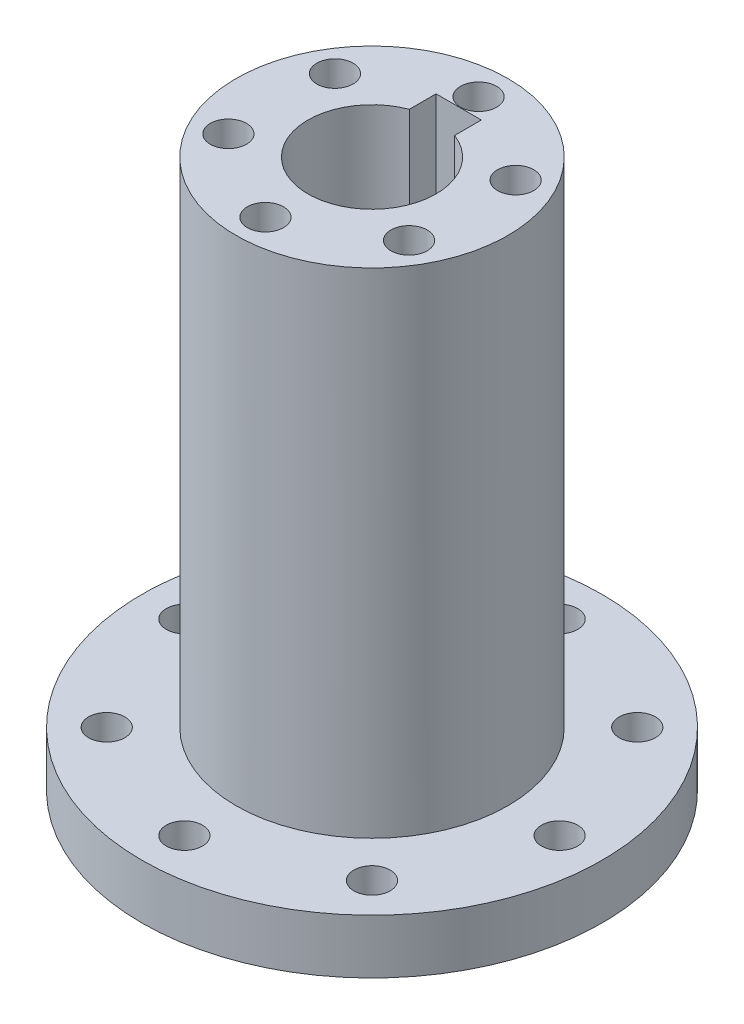
ISO-10303-21;
HEADER;
FILE_DESCRIPTION(('STEP AP214'),'2;1');
FILE_NAME('part.step','',(''),(''),'','','');
FILE_SCHEMA(('AUTOMOTIVE_DESIGN { 1 0 10303 214 1 1 1 1 }'));
ENDSEC;
DATA;
#1=APPLICATION_CONTEXT('core data for automotive mechanical design processes');
#2=APPLICATION_PROTOCOL_DEFINITION('international standard','automotive_design',2000,#1);
#3=PRODUCT_CONTEXT('',#1,'mechanical');
#4=PRODUCT('Part','Part','',(#3));
#5=PRODUCT_RELATED_PRODUCT_CATEGORY('part','',(#4));
#6=PRODUCT_DEFINITION_FORMATION('','',#4);
#7=PRODUCT_DEFINITION_CONTEXT('part definition',#1,'design');
#8=PRODUCT_DEFINITION('design','',#6,#7);
#9=PRODUCT_DEFINITION_SHAPE('','',#8);
#10=(LENGTH_UNIT() NAMED_UNIT(*) SI_UNIT(.MILLI.,.METRE.));
#11=(NAMED_UNIT(*) PLANE_ANGLE_UNIT() SI_UNIT($,.RADIAN.));
#12=(NAMED_UNIT(*) SI_UNIT($,.STERADIAN.) SOLID_ANGLE_UNIT());
#13=UNCERTAINTY_MEASURE_WITH_UNIT(LENGTH_MEASURE(1.E-05),#10,'distance_accuracy_value','');
#14=(GEOMETRIC_REPRESENTATION_CONTEXT(3) GLOBAL_UNCERTAINTY_ASSIGNED_CONTEXT((#13)) GLOBAL_UNIT_ASSIGNED_CONTEXT((#10,
#11,#12)) REPRESENTATION_CONTEXT('',''));
#15=CARTESIAN_POINT('',(0.,0.,0.));
#16=DIRECTION('',(0.,0.,1.));
#17=DIRECTION('',(1.,0.,0.));
#18=AXIS2_PLACEMENT_3D('',#15,#16,#17);
#19=CARTESIAN_POINT('',(0.,0.,0.));
#20=DIRECTION('',(0.,1.,0.));
#21=DIRECTION('',(0.,0.,1.));
#22=AXIS2_PLACEMENT_3D('',#19,#20,#21);
#23=PLANE('',#22);
#24=CARTESIAN_POINT('',(-14.6371103705617,0.,14.6371103705614));
#25=DIRECTION('',(0.,-1.,0.));
#26=DIRECTION('',(0.,0.,-1.));
#27=AXIS2_PLACEMENT_3D('',#24,#25,#26);
#28=CIRCLE('',#27,1.99999999999999);
#29=CARTESIAN_POINT('',(-14.6371103705617,0.,12.6371103705614));
#30=VERTEX_POINT('',#29);
#31=EDGE_CURVE('E174',#30,#30,#28,.T.);
#32=ORIENTED_EDGE('',*,*,#31,.F.);
#33=EDGE_LOOP('',(#32));
#34=FACE_BOUND('',#33,.T.);
#35=CARTESIAN_POINT('',(0.,0.,20.7));
#36=DIRECTION('',(0.,-1.,0.));
#37=DIRECTION('',(0.,0.,-1.));
#38=AXIS2_PLACEMENT_3D('',#35,#36,#37);
#39=CIRCLE('',#38,1.99999999999999);
#40=CARTESIAN_POINT('',(0.,0.,18.7));
#41=VERTEX_POINT('',#40);
#42=EDGE_CURVE('E180',#41,#41,#39,.T.);
#43=ORIENTED_EDGE('',*,*,#42,.F.);
#44=EDGE_LOOP('',(#43));
#45=FACE_BOUND('',#44,.T.);
#46=CARTESIAN_POINT('',(14.6371103705615,0.,14.6371103705616));
#47=DIRECTION('',(0.,-1.,0.));
#48=DIRECTION('',(0.,0.,-1.));
#49=AXIS2_PLACEMENT_3D('',#46,#47,#48);
#50=CIRCLE('',#49,1.99999999999999);
#51=CARTESIAN_POINT('',(14.6371103705615,0.,12.6371103705616));
#52=VERTEX_POINT('',#51);
#53=EDGE_CURVE('E186',#52,#52,#50,.T.);
#54=ORIENTED_EDGE('',*,*,#53,.F.);
#55=EDGE_LOOP('',(#54));
#56=FACE_BOUND('',#55,.T.);
#57=CARTESIAN_POINT('',(20.7,0.,0.));
#58=DIRECTION('',(0.,-1.,0.));
#59=DIRECTION('',(0.,0.,-1.));
#60=AXIS2_PLACEMENT_3D('',#57,#58,#59);
#61=CIRCLE('',#60,1.99999999999999);
#62=CARTESIAN_POINT('',(20.7,0.,-1.99999999999992));
#63=VERTEX_POINT('',#62);
#64=EDGE_CURVE('E192',#63,#63,#61,.T.);
#65=ORIENTED_EDGE('',*,*,#64,.F.);
#66=EDGE_LOOP('',(#65));
#67=FACE_BOUND('',#66,.T.);
#68=CARTESIAN_POINT('',(14.6371103705616,0.,-14.6371103705615));
#69=DIRECTION('',(0.,-1.,0.));
#70=DIRECTION('',(0.,0.,-1.));
#71=AXIS2_PLACEMENT_3D('',#68,#69,#70);
#72=CIRCLE('',#71,1.99999999999999);
#73=CARTESIAN_POINT('',(14.6371103705616,0.,-16.6371103705615));
#74=VERTEX_POINT('',#73);
#75=EDGE_CURVE('E198',#74,#74,#72,.T.);
#76=ORIENTED_EDGE('',*,*,#75,.F.);
#77=EDGE_LOOP('',(#76));
#78=FACE_BOUND('',#77,.T.);
#79=CARTESIAN_POINT('',(0.,0.,-20.7));
#80=DIRECTION('',(0.,-1.,0.));
#81=DIRECTION('',(0.,0.,-1.));
#82=AXIS2_PLACEMENT_3D('',#79,#80,#81);
#83=CIRCLE('',#82,1.99999999999999);
#84=CARTESIAN_POINT('',(0.,0.,-22.7));
#85=VERTEX_POINT('',#84);
#86=EDGE_CURVE('E134',#85,#85,#83,.T.);
#87=ORIENTED_EDGE('',*,*,#86,.F.);
#88=EDGE_LOOP('',(#87));
#89=FACE_BOUND('',#88,.T.);
#90=CARTESIAN_POINT('',(0.,0.,0.));
#91=DIRECTION('',(0.,-1.,0.));
#92=DIRECTION('',(0.,0.,-1.));
#93=AXIS2_PLACEMENT_3D('',#90,#91,#92);
#94=CIRCLE('',#93,10.315);
#95=CARTESIAN_POINT('',(0.,0.,-10.315));
#96=VERTEX_POINT('',#95);
#97=EDGE_CURVE('E131',#96,#96,#94,.T.);
#98=ORIENTED_EDGE('',*,*,#97,.F.);
#99=EDGE_LOOP('',(#98));
#100=FACE_BOUND('',#99,.T.);
#101=CARTESIAN_POINT('',(0.,0.,0.));
#102=DIRECTION('',(0.,1.,0.));
#103=DIRECTION('',(0.,0.,1.));
#104=AXIS2_PLACEMENT_3D('',#101,#102,#103);
#105=CIRCLE('',#104,25.4);
#106=CARTESIAN_POINT('',(0.,0.,25.4));
#107=VERTEX_POINT('',#106);
#108=EDGE_CURVE('E144',#107,#107,#105,.T.);
#109=ORIENTED_EDGE('',*,*,#108,.F.);
#110=EDGE_LOOP('',(#109));
#111=FACE_BOUND('',#110,.T.);
#112=CARTESIAN_POINT('',(-20.7,0.,-2.16820991142159E-13));
#113=DIRECTION('',(0.,-1.,0.));
#114=DIRECTION('',(0.,0.,-1.));
#115=AXIS2_PLACEMENT_3D('',#112,#113,#114);
#116=CIRCLE('',#115,1.99999999999999);
#117=CARTESIAN_POINT('',(-20.7,0.,-2.00000000000021));
#118=VERTEX_POINT('',#117);
#119=EDGE_CURVE('E157',#118,#118,#116,.T.);
#120=ORIENTED_EDGE('',*,*,#119,.F.);
#121=EDGE_LOOP('',(#120));
#122=FACE_BOUND('',#121,.T.);
#123=CARTESIAN_POINT('',(-14.6371103705614,0.,-14.6371103705617));
#124=DIRECTION('',(0.,-1.,0.));
#125=DIRECTION('',(0.,0.,-1.));
#126=AXIS2_PLACEMENT_3D('',#123,#124,#125);
#127=CIRCLE('',#126,1.99999999999999);
#128=CARTESIAN_POINT('',(-14.6371103705614,0.,-16.6371103705617));
#129=VERTEX_POINT('',#128);
#130=EDGE_CURVE('E160',#129,#129,#127,.T.);
#131=ORIENTED_EDGE('',*,*,#130,.F.);
#132=EDGE_LOOP('',(#131));
#133=FACE_BOUND('',#132,.T.);
#134=ADVANCED_FACE('F47',(#34,#45,#56,#67,#78,#89,#100,#111,#122,#133),#23,.F.);
#135=CARTESIAN_POINT('',(0.,6.,0.));
#136=DIRECTION('',(0.,-1.,0.));
#137=DIRECTION('',(0.,0.,-1.));
#138=AXIS2_PLACEMENT_3D('',#135,#136,#137);
#139=CYLINDRICAL_SURFACE('',#138,25.4);
#140=CARTESIAN_POINT('',(0.,6.,0.));
#141=DIRECTION('',(0.,1.,0.));
#142=DIRECTION('',(0.,0.,1.));
#143=AXIS2_PLACEMENT_3D('',#140,#141,#142);
#144=CIRCLE('',#143,25.4);
#145=CARTESIAN_POINT('',(0.,6.,25.4));
#146=VERTEX_POINT('',#145);
#147=EDGE_CURVE('E56',#146,#146,#144,.T.);
#148=ORIENTED_EDGE('',*,*,#147,.F.);
#149=EDGE_LOOP('',(#148));
#150=FACE_BOUND('',#149,.T.);
#151=ORIENTED_EDGE('',*,*,#108,.T.);
#152=EDGE_LOOP('',(#151));
#153=FACE_BOUND('',#152,.T.);
#154=ADVANCED_FACE('F49',(#150,#153),#139,.T.);
#155=CARTESIAN_POINT('',(0.,6.,0.));
#156=DIRECTION('',(0.,1.,0.));
#157=DIRECTION('',(0.,0.,1.));
#158=AXIS2_PLACEMENT_3D('',#155,#156,#157);
#159=PLANE('',#158);
#160=CARTESIAN_POINT('',(-14.6371103705614,6.,-14.6371103705617));
#161=DIRECTION('',(0.,1.,0.));
#162=DIRECTION('',(0.,0.,1.));
#163=AXIS2_PLACEMENT_3D('',#160,#161,#162);
#164=CIRCLE('',#163,1.99999999999999);
#165=CARTESIAN_POINT('',(-14.6371103705614,6.,-12.6371103705617));
#166=VERTEX_POINT('',#165);
#167=EDGE_CURVE('E51',#166,#166,#164,.T.);
#168=ORIENTED_EDGE('',*,*,#167,.F.);
#169=EDGE_LOOP('',(#168));
#170=FACE_BOUND('',#169,.T.);
#171=CARTESIAN_POINT('',(-20.7,6.,-2.16820991142159E-13));
#172=DIRECTION('',(0.,1.,0.));
#173=DIRECTION('',(0.,0.,1.));
#174=AXIS2_PLACEMENT_3D('',#171,#172,#173);
#175=CIRCLE('',#174,1.99999999999999);
#176=CARTESIAN_POINT('',(-20.7,6.,1.99999999999977));
#177=VERTEX_POINT('',#176);
#178=EDGE_CURVE('E171',#177,#177,#175,.T.);
#179=ORIENTED_EDGE('',*,*,#178,.F.);
#180=EDGE_LOOP('',(#179));
#181=FACE_BOUND('',#180,.T.);
#182=CARTESIAN_POINT('',(-14.6371103705617,6.,14.6371103705614));
#183=DIRECTION('',(0.,1.,0.));
#184=DIRECTION('',(0.,0.,1.));
#185=AXIS2_PLACEMENT_3D('',#182,#183,#184);
#186=CIRCLE('',#185,1.99999999999999);
#187=CARTESIAN_POINT('',(-14.6371103705617,6.,16.6371103705614));
#188=VERTEX_POINT('',#187);
#189=EDGE_CURVE('E177',#188,#188,#186,.T.);
#190=ORIENTED_EDGE('',*,*,#189,.F.);
#191=EDGE_LOOP('',(#190));
#192=FACE_BOUND('',#191,.T.);
#193=CARTESIAN_POINT('',(0.,6.,20.7));
#194=DIRECTION('',(0.,1.,0.));
#195=DIRECTION('',(0.,0.,1.));
#196=AXIS2_PLACEMENT_3D('',#193,#194,#195);
#197=CIRCLE('',#196,1.99999999999999);
#198=CARTESIAN_POINT('',(0.,6.,22.7));
#199=VERTEX_POINT('',#198);
#200=EDGE_CURVE('E183',#199,#199,#197,.T.);
#201=ORIENTED_EDGE('',*,*,#200,.F.);
#202=EDGE_LOOP('',(#201));
#203=FACE_BOUND('',#202,.T.);
#204=CARTESIAN_POINT('',(14.6371103705615,6.,14.6371103705616));
#205=DIRECTION('',(0.,1.,0.));
#206=DIRECTION('',(0.,0.,1.));
#207=AXIS2_PLACEMENT_3D('',#204,#205,#206);
#208=CIRCLE('',#207,1.99999999999999);
#209=CARTESIAN_POINT('',(14.6371103705615,6.,16.6371103705616));
#210=VERTEX_POINT('',#209);
#211=EDGE_CURVE('E189',#210,#210,#208,.T.);
#212=ORIENTED_EDGE('',*,*,#211,.F.);
#213=EDGE_LOOP('',(#212));
#214=FACE_BOUND('',#213,.T.);
#215=CARTESIAN_POINT('',(20.7,6.,0.));
#216=DIRECTION('',(0.,1.,0.));
#217=DIRECTION('',(0.,0.,1.));
#218=AXIS2_PLACEMENT_3D('',#215,#216,#217);
#219=CIRCLE('',#218,1.99999999999999);
#220=CARTESIAN_POINT('',(20.7,6.,2.00000000000006));
#221=VERTEX_POINT('',#220);
#222=EDGE_CURVE('E195',#221,#221,#219,.T.);
#223=ORIENTED_EDGE('',*,*,#222,.F.);
#224=EDGE_LOOP('',(#223));
#225=FACE_BOUND('',#224,.T.);
#226=CARTESIAN_POINT('',(14.6371103705616,6.,-14.6371103705615));
#227=DIRECTION('',(0.,1.,0.));
#228=DIRECTION('',(0.,0.,1.));
#229=AXIS2_PLACEMENT_3D('',#226,#227,#228);
#230=CIRCLE('',#229,1.99999999999999);
#231=CARTESIAN_POINT('',(14.6371103705616,6.,-12.6371103705615));
#232=VERTEX_POINT('',#231);
#233=EDGE_CURVE('E201',#232,#232,#230,.T.);
#234=ORIENTED_EDGE('',*,*,#233,.F.);
#235=EDGE_LOOP('',(#234));
#236=FACE_BOUND('',#235,.T.);
#237=CARTESIAN_POINT('',(0.,6.,-20.7));
#238=DIRECTION('',(0.,1.,0.));
#239=DIRECTION('',(0.,0.,1.));
#240=AXIS2_PLACEMENT_3D('',#237,#238,#239);
#241=CIRCLE('',#240,1.99999999999999);
#242=CARTESIAN_POINT('',(0.,6.,-18.7));
#243=VERTEX_POINT('',#242);
#244=EDGE_CURVE('E129',#243,#243,#241,.T.);
#245=ORIENTED_EDGE('',*,*,#244,.F.);
#246=EDGE_LOOP('',(#245));
#247=FACE_BOUND('',#246,.T.);
#248=CARTESIAN_POINT('',(0.,6.,0.));
#249=DIRECTION('',(0.,1.,0.));
#250=DIRECTION('',(0.,0.,1.));
#251=AXIS2_PLACEMENT_3D('',#248,#249,#250);
#252=CIRCLE('',#251,15.);
#253=CARTESIAN_POINT('',(0.,6.,15.));
#254=VERTEX_POINT('',#253);
#255=EDGE_CURVE('E11',#254,#254,#252,.T.);
#256=ORIENTED_EDGE('',*,*,#255,.F.);
#257=EDGE_LOOP('',(#256));
#258=FACE_BOUND('',#257,.T.);
#259=ORIENTED_EDGE('',*,*,#147,.T.);
#260=EDGE_LOOP('',(#259));
#261=FACE_BOUND('',#260,.T.);
#262=ADVANCED_FACE('F231',(#170,#181,#192,#203,#214,#225,#236,#247,#258,#261),#159,.T.);
#263=CARTESIAN_POINT('',(0.,60.5,0.));
#264=DIRECTION('',(0.,-1.,0.));
#265=DIRECTION('',(0.,0.,-1.));
#266=AXIS2_PLACEMENT_3D('',#263,#264,#265);
#267=CYLINDRICAL_SURFACE('',#266,15.);
#268=ORIENTED_EDGE('',*,*,#255,.T.);
#269=EDGE_LOOP('',(#268));
#270=FACE_BOUND('',#269,.T.);
#271=CARTESIAN_POINT('',(0.,60.5,0.));
#272=DIRECTION('',(0.,-1.,0.));
#273=DIRECTION('',(0.,0.,-1.));
#274=AXIS2_PLACEMENT_3D('',#271,#272,#273);
#275=CIRCLE('',#274,15.);
#276=CARTESIAN_POINT('',(0.,60.5,-15.));
#277=VERTEX_POINT('',#276);
#278=EDGE_CURVE('E140',#277,#277,#275,.T.);
#279=ORIENTED_EDGE('',*,*,#278,.T.);
#280=EDGE_LOOP('',(#279));
#281=FACE_BOUND('',#280,.T.);
#282=ADVANCED_FACE('F224',(#270,#281),#267,.T.);
#283=CARTESIAN_POINT('',(0.,60.5,0.));
#284=DIRECTION('',(0.,-1.,0.));
#285=DIRECTION('',(0.,0.,-1.));
#286=AXIS2_PLACEMENT_3D('',#283,#284,#285);
#287=PLANE('',#286);
#288=CARTESIAN_POINT('',(-0.124994944390991,60.5,11.6364975943742));
#289=DIRECTION('',(0.,1.,0.));
#290=DIRECTION('',(0.,0.,1.));
#291=AXIS2_PLACEMENT_3D('',#288,#289,#290);
#292=CIRCLE('',#291,2.);
#293=CARTESIAN_POINT('',(-0.124994944390991,60.5,13.6364975943742));
#294=VERTEX_POINT('',#293);
#295=EDGE_CURVE('E366',#294,#294,#292,.T.);
#296=ORIENTED_EDGE('',*,*,#295,.F.);
#297=EDGE_LOOP('',(#296));
#298=FACE_BOUND('',#297,.T.);
#299=CARTESIAN_POINT('',(10.0150050556091,60.5,5.9264975943743));
#300=DIRECTION('',(0.,1.,0.));
#301=DIRECTION('',(0.,0.,1.));
#302=AXIS2_PLACEMENT_3D('',#299,#300,#301);
#303=CIRCLE('',#302,2.);
#304=CARTESIAN_POINT('',(10.0150050556091,60.5,7.9264975943743));
#305=VERTEX_POINT('',#304);
#306=EDGE_CURVE('E374',#305,#305,#303,.T.);
#307=ORIENTED_EDGE('',*,*,#306,.F.);
#308=EDGE_LOOP('',(#307));
#309=FACE_BOUND('',#308,.T.);
#310=CARTESIAN_POINT('',(10.14,60.5,-5.71));
#311=DIRECTION('',(0.,1.,0.));
#312=DIRECTION('',(0.,0.,1.));
#313=AXIS2_PLACEMENT_3D('',#310,#311,#312);
#314=CIRCLE('',#313,2.);
#315=CARTESIAN_POINT('',(10.14,60.5,-3.71));
#316=VERTEX_POINT('',#315);
#317=EDGE_CURVE('E380',#316,#316,#314,.T.);
#318=ORIENTED_EDGE('',*,*,#317,.F.);
#319=EDGE_LOOP('',(#318));
#320=FACE_BOUND('',#319,.T.);
#321=CARTESIAN_POINT('',(0.124994944390909,60.5,-11.6364975943742));
#322=DIRECTION('',(0.,1.,0.));
#323=DIRECTION('',(0.,0.,1.));
#324=AXIS2_PLACEMENT_3D('',#321,#322,#323);
#325=CIRCLE('',#324,2.);
#326=CARTESIAN_POINT('',(0.124994944390909,60.5,-9.63649759437421));
#327=VERTEX_POINT('',#326);
#328=EDGE_CURVE('E386',#327,#327,#325,.T.);
#329=ORIENTED_EDGE('',*,*,#328,.F.);
#330=EDGE_LOOP('',(#329));
#331=FACE_BOUND('',#330,.T.);
#332=CARTESIAN_POINT('',(-10.0150050556091,60.5,-5.92649759437423));
#333=DIRECTION('',(0.,1.,0.));
#334=DIRECTION('',(0.,0.,1.));
#335=AXIS2_PLACEMENT_3D('',#332,#333,#334);
#336=CIRCLE('',#335,2.);
#337=CARTESIAN_POINT('',(-10.0150050556091,60.5,-3.92649759437423));
#338=VERTEX_POINT('',#337);
#339=EDGE_CURVE('E392',#338,#338,#336,.T.);
#340=ORIENTED_EDGE('',*,*,#339,.F.);
#341=EDGE_LOOP('',(#340));
#342=FACE_BOUND('',#341,.T.);
#343=CARTESIAN_POINT('',(-10.14,60.5,5.71));
#344=DIRECTION('',(0.,1.,0.));
#345=DIRECTION('',(0.,0.,1.));
#346=AXIS2_PLACEMENT_3D('',#343,#344,#345);
#347=CIRCLE('',#346,2.);
#348=CARTESIAN_POINT('',(-10.14,60.5,7.71));
#349=VERTEX_POINT('',#348);
#350=EDGE_CURVE('E166',#349,#349,#347,.T.);
#351=ORIENTED_EDGE('',*,*,#350,.F.);
#352=EDGE_LOOP('',(#351));
#353=FACE_BOUND('',#352,.T.);
#354=CARTESIAN_POINT('',(0.,60.5,0.));
#355=DIRECTION('',(0.,-1.,0.));
#356=DIRECTION('',(0.,0.,-1.));
#357=AXIS2_PLACEMENT_3D('',#354,#355,#356);
#358=CIRCLE('',#357,7.07);
#359=CARTESIAN_POINT('',(2.5,60.5,-6.61323672644493));
#360=VERTEX_POINT('',#359);
#361=CARTESIAN_POINT('',(-2.5,60.5,-6.61323672644493));
#362=VERTEX_POINT('',#361);
#363=EDGE_CURVE('E128',#360,#362,#358,.T.);
#364=ORIENTED_EDGE('',*,*,#363,.T.);
#365=DIRECTION('',(0.,0.,1.));
#366=VECTOR('',#365,1.);
#367=CARTESIAN_POINT('',(-2.5,60.5,-9.57));
#368=LINE('',#367,#366);
#369=CARTESIAN_POINT('',(-2.5,60.5,-9.57));
#370=VERTEX_POINT('',#369);
#371=EDGE_CURVE('E111',#370,#362,#368,.T.);
#372=ORIENTED_EDGE('',*,*,#371,.F.);
#373=DIRECTION('',(-1.,0.,0.));
#374=VECTOR('',#373,1.);
#375=CARTESIAN_POINT('',(-2.5,60.5,-9.57));
#376=LINE('',#375,#374);
#377=CARTESIAN_POINT('',(2.5,60.5,-9.57));
#378=VERTEX_POINT('',#377);
#379=EDGE_CURVE('E117',#378,#370,#376,.T.);
#380=ORIENTED_EDGE('',*,*,#379,.F.);
#381=DIRECTION('',(0.,0.,-1.));
#382=VECTOR('',#381,1.);
#383=CARTESIAN_POINT('',(2.5,60.5,-9.57));
#384=LINE('',#383,#382);
#385=EDGE_CURVE('E360',#360,#378,#384,.T.);
#386=ORIENTED_EDGE('',*,*,#385,.F.);
#387=EDGE_LOOP('',(#364,#372,#380,#386));
#388=FACE_BOUND('',#387,.T.);
#389=ORIENTED_EDGE('',*,*,#278,.F.);
#390=EDGE_LOOP('',(#389));
#391=FACE_BOUND('',#390,.T.);
#392=ADVANCED_FACE('F214',(#298,#309,#320,#331,#342,#353,#388,#391),#287,.F.);
#393=CARTESIAN_POINT('',(0.,38.1,0.));
#394=DIRECTION('',(0.,-1.,0.));
#395=DIRECTION('',(0.,0.,-1.));
#396=AXIS2_PLACEMENT_3D('',#393,#394,#395);
#397=CYLINDRICAL_SURFACE('',#396,10.315);
#398=CARTESIAN_POINT('',(0.,38.1,0.));
#399=DIRECTION('',(0.,-1.,0.));
#400=DIRECTION('',(0.,0.,-1.));
#401=AXIS2_PLACEMENT_3D('',#398,#399,#400);
#402=CIRCLE('',#401,10.315);
#403=CARTESIAN_POINT('',(0.,38.1,-10.315));
#404=VERTEX_POINT('',#403);
#405=EDGE_CURVE('E137',#404,#404,#402,.T.);
#406=CARTESIAN_POINT('',(0.,38.1,-10.315));
#407=CARTESIAN_POINT('',(0.,37.703125,-10.315));
#408=CARTESIAN_POINT('',(0.,37.30625,-10.315));
#409=CARTESIAN_POINT('',(0.,36.5125,-10.315));
#410=CARTESIAN_POINT('',(0.,36.115625,-10.315));
#411=CARTESIAN_POINT('',(0.,35.321875,-10.315));
#412=CARTESIAN_POINT('',(0.,34.925,-10.315));
#413=CARTESIAN_POINT('',(0.,34.13125,-10.315));
#414=CARTESIAN_POINT('',(0.,33.734375,-10.315));
#415=CARTESIAN_POINT('',(0.,32.940625,-10.315));
#416=CARTESIAN_POINT('',(0.,32.54375,-10.315));
#417=CARTESIAN_POINT('',(0.,31.75,-10.315));
#418=CARTESIAN_POINT('',(0.,31.353125,-10.315));
#419=CARTESIAN_POINT('',(0.,30.559375,-10.315));
#420=CARTESIAN_POINT('',(0.,30.1625,-10.315));
#421=CARTESIAN_POINT('',(0.,29.36875,-10.315));
#422=CARTESIAN_POINT('',(0.,28.971875,-10.315));
#423=CARTESIAN_POINT('',(0.,28.178125,-10.315));
#424=CARTESIAN_POINT('',(0.,27.78125,-10.315));
#425=CARTESIAN_POINT('',(0.,26.9875,-10.315));
#426=CARTESIAN_POINT('',(0.,26.590625,-10.315));
#427=CARTESIAN_POINT('',(0.,25.796875,-10.315));
#428=CARTESIAN_POINT('',(0.,25.4,-10.315));
#429=CARTESIAN_POINT('',(0.,24.60625,-10.315));
#430=CARTESIAN_POINT('',(0.,24.209375,-10.315));
#431=CARTESIAN_POINT('',(0.,23.415625,-10.315));
#432=CARTESIAN_POINT('',(0.,23.01875,-10.315));
#433=CARTESIAN_POINT('',(0.,22.225,-10.315));
#434=CARTESIAN_POINT('',(0.,21.828125,-10.315));
#435=CARTESIAN_POINT('',(0.,21.034375,-10.315));
#436=CARTESIAN_POINT('',(0.,20.6375,-10.315));
#437=CARTESIAN_POINT('',(0.,19.84375,-10.315));
#438=CARTESIAN_POINT('',(0.,19.446875,-10.315));
#439=CARTESIAN_POINT('',(0.,18.653125,-10.315));
#440=CARTESIAN_POINT('',(0.,18.25625,-10.315));
#441=CARTESIAN_POINT('',(0.,17.4625,-10.315));
#442=CARTESIAN_POINT('',(0.,17.065625,-10.315));
#443=CARTESIAN_POINT('',(0.,16.271875,-10.315));
#444=CARTESIAN_POINT('',(0.,15.875,-10.315));
#445=CARTESIAN_POINT('',(0.,15.08125,-10.315));
#446=CARTESIAN_POINT('',(0.,14.684375,-10.315));
#447=CARTESIAN_POINT('',(0.,13.890625,-10.315));
#448=CARTESIAN_POINT('',(0.,13.49375,-10.315));
#449=CARTESIAN_POINT('',(0.,12.7,-10.315));
#450=CARTESIAN_POINT('',(0.,12.303125,-10.315));
#451=CARTESIAN_POINT('',(0.,11.509375,-10.315));
#452=CARTESIAN_POINT('',(0.,11.1125,-10.315));
#453=CARTESIAN_POINT('',(0.,10.31875,-10.315));
#454=CARTESIAN_POINT('',(0.,9.921875,-10.315));
#455=CARTESIAN_POINT('',(0.,9.128125,-10.315));
#456=CARTESIAN_POINT('',(0.,8.73125,-10.315));
#457=CARTESIAN_POINT('',(0.,7.9375,-10.315));
#458=CARTESIAN_POINT('',(0.,7.540625,-10.315));
#459=CARTESIAN_POINT('',(0.,6.746875,-10.315));
#460=CARTESIAN_POINT('',(0.,6.35,-10.315));
#461=CARTESIAN_POINT('',(0.,5.55625,-10.315));
#462=CARTESIAN_POINT('',(0.,5.159375,-10.315));
#463=CARTESIAN_POINT('',(0.,4.365625,-10.315));
#464=CARTESIAN_POINT('',(0.,3.96875,-10.315));
#465=CARTESIAN_POINT('',(0.,3.175,-10.315));
#466=CARTESIAN_POINT('',(0.,2.778125,-10.315));
#467=CARTESIAN_POINT('',(0.,1.984375,-10.315));
#468=CARTESIAN_POINT('',(0.,1.5875,-10.315));
#469=CARTESIAN_POINT('',(0.,0.79375,-10.315));
#470=CARTESIAN_POINT('',(0.,0.396875,-10.315));
#471=CARTESIAN_POINT('',(0.,0.,-10.315));
#472=B_SPLINE_CURVE_WITH_KNOTS('',3,(#406,#407,#408,#409,#410,#411,#412,#413,#414,#415,#416,
#417,#418,#419,#420,#421,#422,#423,#424,#425,#426,#427,#428,#429,#430,#431,#432,#433,#434,#435,
#436,#437,#438,#439,#440,#441,#442,#443,#444,#445,#446,#447,#448,#449,#450,#451,#452,#453,#454,
#455,#456,#457,#458,#459,#460,#461,#462,#463,#464,#465,#466,#467,#468,#469,#470,#471),
.UNSPECIFIED.,.F.,.F.,(4,2,2,2,2,2,2,2,2,2,2,2,2,2,2,2,2,2,2,2,2,2,2,2,2,2,2,2,2,2,2,2,4),(0.,
1.19062499999999,2.38124999999999,3.571875,4.7625,5.953125,7.14375,8.334375,9.525,10.715625,
11.90625,13.096875,14.2875,15.478125,16.66875,17.859375,19.05,20.240625,21.43125,22.621875,
23.8125,25.003125,26.19375,27.384375,28.575,29.765625,30.95625,32.146875,33.3375,34.528125,
35.71875,36.909375,38.1),.UNSPECIFIED.);
#473=EDGE_CURVE('BSEAM212',#404,#96,#472,.T.);
#474=ORIENTED_EDGE('',*,*,#405,.F.);
#475=ORIENTED_EDGE('',*,*,#97,.T.);
#476=ORIENTED_EDGE('',*,*,#473,.T.);
#477=ORIENTED_EDGE('',*,*,#473,.F.);
#478=EDGE_LOOP('',(#474,#476,#475,#477));
#479=FACE_BOUND('',#478,.T.);
#480=ADVANCED_FACE('F212',(#479),#397,.F.);
#481=CARTESIAN_POINT('',(0.,38.1,0.));
#482=DIRECTION('',(0.,-1.,0.));
#483=DIRECTION('',(0.,0.,-1.));
#484=AXIS2_PLACEMENT_3D('',#481,#482,#483);
#485=PLANE('',#484);
#486=DIRECTION('',(0.,0.,1.));
#487=VECTOR('',#486,1.);
#488=CARTESIAN_POINT('',(-2.5,38.1,-9.57));
#489=LINE('',#488,#487);
#490=CARTESIAN_POINT('',(-2.5,38.1,-9.57));
#491=VERTEX_POINT('',#490);
#492=CARTESIAN_POINT('',(-2.5,38.1,-6.61323672644493));
#493=VERTEX_POINT('',#492);
#494=EDGE_CURVE('E108',#491,#493,#489,.T.);
#495=ORIENTED_EDGE('',*,*,#494,.T.);
#496=CARTESIAN_POINT('',(0.,38.1,0.));
#497=DIRECTION('',(0.,-1.,0.));
#498=DIRECTION('',(0.,0.,-1.));
#499=AXIS2_PLACEMENT_3D('',#496,#497,#498);
#500=CIRCLE('',#499,7.07);
#501=CARTESIAN_POINT('',(2.5,38.1,-6.61323672644493));
#502=VERTEX_POINT('',#501);
#503=EDGE_CURVE('E124',#502,#493,#500,.T.);
#504=ORIENTED_EDGE('',*,*,#503,.F.);
#505=DIRECTION('',(0.,0.,-1.));
#506=VECTOR('',#505,1.);
#507=CARTESIAN_POINT('',(2.5,38.1,-9.57));
#508=LINE('',#507,#506);
#509=CARTESIAN_POINT('',(2.5,38.1,-9.57));
#510=VERTEX_POINT('',#509);
#511=EDGE_CURVE('E64',#502,#510,#508,.T.);
#512=ORIENTED_EDGE('',*,*,#511,.T.);
#513=DIRECTION('',(-1.,0.,0.));
#514=VECTOR('',#513,1.);
#515=CARTESIAN_POINT('',(-2.5,38.1,-9.57));
#516=LINE('',#515,#514);
#517=EDGE_CURVE('E125',#510,#491,#516,.T.);
#518=ORIENTED_EDGE('',*,*,#517,.T.);
#519=EDGE_LOOP('',(#495,#504,#512,#518));
#520=FACE_BOUND('',#519,.T.);
#521=ORIENTED_EDGE('',*,*,#405,.T.);
#522=EDGE_LOOP('',(#521));
#523=FACE_BOUND('',#522,.T.);
#524=ADVANCED_FACE('F122',(#520,#523),#485,.T.);
#525=CARTESIAN_POINT('',(0.,60.5,0.));
#526=DIRECTION('',(0.,-1.,0.));
#527=DIRECTION('',(0.,0.,-1.));
#528=AXIS2_PLACEMENT_3D('',#525,#526,#527);
#529=CYLINDRICAL_SURFACE('',#528,7.07);
#530=ORIENTED_EDGE('',*,*,#503,.T.);
#531=DIRECTION('',(0.,1.,0.));
#532=VECTOR('',#531,1.);
#533=CARTESIAN_POINT('',(-2.5,-0.001000000000001,-6.61323672644493));
#534=LINE('',#533,#532);
#535=EDGE_CURVE('E105',#493,#362,#534,.T.);
#536=ORIENTED_EDGE('',*,*,#535,.T.);
#537=ORIENTED_EDGE('',*,*,#363,.F.);
#538=DIRECTION('',(0.,1.,0.));
#539=VECTOR('',#538,1.);
#540=CARTESIAN_POINT('',(2.5,-0.001000000000001,-6.61323672644493));
#541=LINE('',#540,#539);
#542=EDGE_CURVE('E116',#502,#360,#541,.T.);
#543=ORIENTED_EDGE('',*,*,#542,.F.);
#544=EDGE_LOOP('',(#530,#536,#537,#543));
#545=FACE_BOUND('',#544,.T.);
#546=ADVANCED_FACE('F127',(#545),#529,.F.);
#547=CARTESIAN_POINT('',(0.,0.,-20.7));
#548=DIRECTION('',(0.,-1.,0.));
#549=DIRECTION('',(0.,0.,-1.));
#550=AXIS2_PLACEMENT_3D('',#547,#548,#549);
#551=CYLINDRICAL_SURFACE('',#550,1.99999999999999);
#552=ORIENTED_EDGE('',*,*,#244,.T.);
#553=EDGE_LOOP('',(#552));
#554=FACE_BOUND('',#553,.T.);
#555=ORIENTED_EDGE('',*,*,#86,.T.);
#556=EDGE_LOOP('',(#555));
#557=FACE_BOUND('',#556,.T.);
#558=ADVANCED_FACE('F207',(#554,#557),#551,.F.);
#559=CARTESIAN_POINT('',(14.6371103705616,0.,-14.6371103705615));
#560=DIRECTION('',(0.,-1.,0.));
#561=DIRECTION('',(0.,0.,-1.));
#562=AXIS2_PLACEMENT_3D('',#559,#560,#561);
#563=CYLINDRICAL_SURFACE('',#562,1.99999999999999);
#564=ORIENTED_EDGE('',*,*,#233,.T.);
#565=EDGE_LOOP('',(#564));
#566=FACE_BOUND('',#565,.T.);
#567=ORIENTED_EDGE('',*,*,#75,.T.);
#568=EDGE_LOOP('',(#567));
#569=FACE_BOUND('',#568,.T.);
#570=ADVANCED_FACE('F264',(#566,#569),#563,.F.);
#571=CARTESIAN_POINT('',(20.7,0.,0.));
#572=DIRECTION('',(0.,-1.,0.));
#573=DIRECTION('',(0.,0.,-1.));
#574=AXIS2_PLACEMENT_3D('',#571,#572,#573);
#575=CYLINDRICAL_SURFACE('',#574,1.99999999999999);
#576=ORIENTED_EDGE('',*,*,#222,.T.);
#577=EDGE_LOOP('',(#576));
#578=FACE_BOUND('',#577,.T.);
#579=ORIENTED_EDGE('',*,*,#64,.T.);
#580=EDGE_LOOP('',(#579));
#581=FACE_BOUND('',#580,.T.);
#582=ADVANCED_FACE('F268',(#578,#581),#575,.F.);
#583=CARTESIAN_POINT('',(14.6371103705615,0.,14.6371103705616));
#584=DIRECTION('',(0.,-1.,0.));
#585=DIRECTION('',(0.,0.,-1.));
#586=AXIS2_PLACEMENT_3D('',#583,#584,#585);
#587=CYLINDRICAL_SURFACE('',#586,1.99999999999999);
#588=ORIENTED_EDGE('',*,*,#211,.T.);
#589=EDGE_LOOP('',(#588));
#590=FACE_BOUND('',#589,.T.);
#591=ORIENTED_EDGE('',*,*,#53,.T.);
#592=EDGE_LOOP('',(#591));
#593=FACE_BOUND('',#592,.T.);
#594=ADVANCED_FACE('F275',(#590,#593),#587,.F.);
#595=CARTESIAN_POINT('',(0.,0.,20.7));
#596=DIRECTION('',(0.,-1.,0.));
#597=DIRECTION('',(0.,0.,-1.));
#598=AXIS2_PLACEMENT_3D('',#595,#596,#597);
#599=CYLINDRICAL_SURFACE('',#598,1.99999999999999);
#600=ORIENTED_EDGE('',*,*,#200,.T.);
#601=EDGE_LOOP('',(#600));
#602=FACE_BOUND('',#601,.T.);
#603=ORIENTED_EDGE('',*,*,#42,.T.);
#604=EDGE_LOOP('',(#603));
#605=FACE_BOUND('',#604,.T.);
#606=ADVANCED_FACE('F279',(#602,#605),#599,.F.);
#607=CARTESIAN_POINT('',(-14.6371103705617,0.,14.6371103705614));
#608=DIRECTION('',(0.,-1.,0.));
#609=DIRECTION('',(0.,0.,-1.));
#610=AXIS2_PLACEMENT_3D('',#607,#608,#609);
#611=CYLINDRICAL_SURFACE('',#610,1.99999999999999);
#612=ORIENTED_EDGE('',*,*,#189,.T.);
#613=EDGE_LOOP('',(#612));
#614=FACE_BOUND('',#613,.T.);
#615=ORIENTED_EDGE('',*,*,#31,.T.);
#616=EDGE_LOOP('',(#615));
#617=FACE_BOUND('',#616,.T.);
#618=ADVANCED_FACE('F283',(#614,#617),#611,.F.);
#619=CARTESIAN_POINT('',(-20.7,0.,-2.16820991142159E-13));
#620=DIRECTION('',(0.,-1.,0.));
#621=DIRECTION('',(0.,0.,-1.));
#622=AXIS2_PLACEMENT_3D('',#619,#620,#621);
#623=CYLINDRICAL_SURFACE('',#622,1.99999999999999);
#624=ORIENTED_EDGE('',*,*,#178,.T.);
#625=EDGE_LOOP('',(#624));
#626=FACE_BOUND('',#625,.T.);
#627=ORIENTED_EDGE('',*,*,#119,.T.);
#628=EDGE_LOOP('',(#627));
#629=FACE_BOUND('',#628,.T.);
#630=ADVANCED_FACE('F287',(#626,#629),#623,.F.);
#631=CARTESIAN_POINT('',(-14.6371103705614,0.,-14.6371103705617));
#632=DIRECTION('',(0.,-1.,0.));
#633=DIRECTION('',(0.,0.,-1.));
#634=AXIS2_PLACEMENT_3D('',#631,#632,#633);
#635=CYLINDRICAL_SURFACE('',#634,1.99999999999999);
#636=ORIENTED_EDGE('',*,*,#167,.T.);
#637=EDGE_LOOP('',(#636));
#638=FACE_BOUND('',#637,.T.);
#639=ORIENTED_EDGE('',*,*,#130,.T.);
#640=EDGE_LOOP('',(#639));
#641=FACE_BOUND('',#640,.T.);
#642=ADVANCED_FACE('F291',(#638,#641),#635,.F.);
#643=CARTESIAN_POINT('',(-10.14,55.5,5.71));
#644=DIRECTION('',(0.,1.,0.));
#645=DIRECTION('',(0.,0.,1.));
#646=AXIS2_PLACEMENT_3D('',#643,#644,#645);
#647=CONICAL_SURFACE('',#646,2.,1.02974425867665);
#648=CARTESIAN_POINT('',(-10.14,54.2982787619449,5.71));
#649=VERTEX_POINT('',#648);
#650=VERTEX_LOOP('',#649);
#651=FACE_BOUND('',#650,.T.);
#652=CARTESIAN_POINT('',(-10.14,55.5,5.71));
#653=DIRECTION('',(0.,1.,0.));
#654=DIRECTION('',(0.,0.,1.));
#655=AXIS2_PLACEMENT_3D('',#652,#653,#654);
#656=CIRCLE('',#655,2.);
#657=CARTESIAN_POINT('',(-10.14,55.5,7.71));
#658=VERTEX_POINT('',#657);
#659=EDGE_CURVE('E162',#658,#658,#656,.T.);
#660=ORIENTED_EDGE('',*,*,#659,.T.);
#661=EDGE_LOOP('',(#660));
#662=FACE_BOUND('',#661,.T.);
#663=ADVANCED_FACE('F295',(#651,#662),#647,.F.);
#664=CARTESIAN_POINT('',(-10.14,60.5,5.71));
#665=DIRECTION('',(0.,1.,0.));
#666=DIRECTION('',(0.,0.,1.));
#667=AXIS2_PLACEMENT_3D('',#664,#665,#666);
#668=CYLINDRICAL_SURFACE('',#667,2.);
#669=ORIENTED_EDGE('',*,*,#659,.F.);
#670=EDGE_LOOP('',(#669));
#671=FACE_BOUND('',#670,.T.);
#672=ORIENTED_EDGE('',*,*,#350,.T.);
#673=EDGE_LOOP('',(#672));
#674=FACE_BOUND('',#673,.T.);
#675=ADVANCED_FACE('F299',(#671,#674),#668,.F.);
#676=CARTESIAN_POINT('',(-10.0150050556091,55.5,-5.92649759437423));
#677=DIRECTION('',(0.,1.,0.));
#678=DIRECTION('',(0.,0.,1.));
#679=AXIS2_PLACEMENT_3D('',#676,#677,#678);
#680=CONICAL_SURFACE('',#679,2.,1.02974425867665);
#681=CARTESIAN_POINT('',(-10.0150050556091,54.2982787619449,-5.92649759437423));
#682=VERTEX_POINT('',#681);
#683=VERTEX_LOOP('',#682);
#684=FACE_BOUND('',#683,.T.);
#685=CARTESIAN_POINT('',(-10.0150050556091,55.5,-5.92649759437423));
#686=DIRECTION('',(0.,1.,0.));
#687=DIRECTION('',(0.,0.,1.));
#688=AXIS2_PLACEMENT_3D('',#685,#686,#687);
#689=CIRCLE('',#688,2.);
#690=CARTESIAN_POINT('',(-10.0150050556091,55.5,-3.92649759437423));
#691=VERTEX_POINT('',#690);
#692=EDGE_CURVE('E395',#691,#691,#689,.T.);
#693=ORIENTED_EDGE('',*,*,#692,.T.);
#694=EDGE_LOOP('',(#693));
#695=FACE_BOUND('',#694,.T.);
#696=ADVANCED_FACE('F302',(#684,#695),#680,.F.);
#697=CARTESIAN_POINT('',(-10.0150050556091,60.5,-5.92649759437423));
#698=DIRECTION('',(0.,1.,0.));
#699=DIRECTION('',(0.,0.,1.));
#700=AXIS2_PLACEMENT_3D('',#697,#698,#699);
#701=CYLINDRICAL_SURFACE('',#700,2.);
#702=ORIENTED_EDGE('',*,*,#692,.F.);
#703=EDGE_LOOP('',(#702));
#704=FACE_BOUND('',#703,.T.);
#705=ORIENTED_EDGE('',*,*,#339,.T.);
#706=EDGE_LOOP('',(#705));
#707=FACE_BOUND('',#706,.T.);
#708=ADVANCED_FACE('F306',(#704,#707),#701,.F.);
#709=CARTESIAN_POINT('',(0.124994944390909,55.5,-11.6364975943742));
#710=DIRECTION('',(0.,1.,0.));
#711=DIRECTION('',(0.,0.,1.));
#712=AXIS2_PLACEMENT_3D('',#709,#710,#711);
#713=CONICAL_SURFACE('',#712,2.,1.02974425867665);
#714=CARTESIAN_POINT('',(0.124994944390908,54.2982787619449,-11.6364975943742));
#715=VERTEX_POINT('',#714);
#716=VERTEX_LOOP('',#715);
#717=FACE_BOUND('',#716,.T.);
#718=CARTESIAN_POINT('',(0.124994944390909,55.5,-11.6364975943742));
#719=DIRECTION('',(0.,1.,0.));
#720=DIRECTION('',(0.,0.,1.));
#721=AXIS2_PLACEMENT_3D('',#718,#719,#720);
#722=CIRCLE('',#721,2.);
#723=CARTESIAN_POINT('',(0.124994944390909,55.5,-9.63649759437421));
#724=VERTEX_POINT('',#723);
#725=EDGE_CURVE('E389',#724,#724,#722,.T.);
#726=ORIENTED_EDGE('',*,*,#725,.T.);
#727=EDGE_LOOP('',(#726));
#728=FACE_BOUND('',#727,.T.);
#729=ADVANCED_FACE('F310',(#717,#728),#713,.F.);
#730=CARTESIAN_POINT('',(0.124994944390909,60.5,-11.6364975943742));
#731=DIRECTION('',(0.,1.,0.));
#732=DIRECTION('',(0.,0.,1.));
#733=AXIS2_PLACEMENT_3D('',#730,#731,#732);
#734=CYLINDRICAL_SURFACE('',#733,2.);
#735=ORIENTED_EDGE('',*,*,#725,.F.);
#736=EDGE_LOOP('',(#735));
#737=FACE_BOUND('',#736,.T.);
#738=ORIENTED_EDGE('',*,*,#328,.T.);
#739=EDGE_LOOP('',(#738));
#740=FACE_BOUND('',#739,.T.);
#741=ADVANCED_FACE('F314',(#737,#740),#734,.F.);
#742=CARTESIAN_POINT('',(10.14,55.5,-5.71));
#743=DIRECTION('',(0.,1.,0.));
#744=DIRECTION('',(0.,0.,1.));
#745=AXIS2_PLACEMENT_3D('',#742,#743,#744);
#746=CONICAL_SURFACE('',#745,2.,1.02974425867665);
#747=CARTESIAN_POINT('',(10.14,54.2982787619449,-5.71));
#748=VERTEX_POINT('',#747);
#749=VERTEX_LOOP('',#748);
#750=FACE_BOUND('',#749,.T.);
#751=CARTESIAN_POINT('',(10.14,55.5,-5.71));
#752=DIRECTION('',(0.,1.,0.));
#753=DIRECTION('',(0.,0.,1.));
#754=AXIS2_PLACEMENT_3D('',#751,#752,#753);
#755=CIRCLE('',#754,2.);
#756=CARTESIAN_POINT('',(10.14,55.5,-3.71));
#757=VERTEX_POINT('',#756);
#758=EDGE_CURVE('E383',#757,#757,#755,.T.);
#759=ORIENTED_EDGE('',*,*,#758,.T.);
#760=EDGE_LOOP('',(#759));
#761=FACE_BOUND('',#760,.T.);
#762=ADVANCED_FACE('F318',(#750,#761),#746,.F.);
#763=CARTESIAN_POINT('',(10.14,60.5,-5.71));
#764=DIRECTION('',(0.,1.,0.));
#765=DIRECTION('',(0.,0.,1.));
#766=AXIS2_PLACEMENT_3D('',#763,#764,#765);
#767=CYLINDRICAL_SURFACE('',#766,2.);
#768=ORIENTED_EDGE('',*,*,#758,.F.);
#769=EDGE_LOOP('',(#768));
#770=FACE_BOUND('',#769,.T.);
#771=ORIENTED_EDGE('',*,*,#317,.T.);
#772=EDGE_LOOP('',(#771));
#773=FACE_BOUND('',#772,.T.);
#774=ADVANCED_FACE('F322',(#770,#773),#767,.F.);
#775=CARTESIAN_POINT('',(10.0150050556091,55.5,5.9264975943743));
#776=DIRECTION('',(0.,1.,0.));
#777=DIRECTION('',(0.,0.,1.));
#778=AXIS2_PLACEMENT_3D('',#775,#776,#777);
#779=CONICAL_SURFACE('',#778,2.,1.02974425867665);
#780=CARTESIAN_POINT('',(10.0150050556091,54.2982787619449,5.9264975943743));
#781=VERTEX_POINT('',#780);
#782=VERTEX_LOOP('',#781);
#783=FACE_BOUND('',#782,.T.);
#784=CARTESIAN_POINT('',(10.0150050556091,55.5,5.9264975943743));
#785=DIRECTION('',(0.,1.,0.));
#786=DIRECTION('',(0.,0.,1.));
#787=AXIS2_PLACEMENT_3D('',#784,#785,#786);
#788=CIRCLE('',#787,2.);
#789=CARTESIAN_POINT('',(10.0150050556091,55.5,7.9264975943743));
#790=VERTEX_POINT('',#789);
#791=EDGE_CURVE('E377',#790,#790,#788,.T.);
#792=ORIENTED_EDGE('',*,*,#791,.T.);
#793=EDGE_LOOP('',(#792));
#794=FACE_BOUND('',#793,.T.);
#795=ADVANCED_FACE('F326',(#783,#794),#779,.F.);
#796=CARTESIAN_POINT('',(10.0150050556091,60.5,5.9264975943743));
#797=DIRECTION('',(0.,1.,0.));
#798=DIRECTION('',(0.,0.,1.));
#799=AXIS2_PLACEMENT_3D('',#796,#797,#798);
#800=CYLINDRICAL_SURFACE('',#799,2.);
#801=ORIENTED_EDGE('',*,*,#791,.F.);
#802=EDGE_LOOP('',(#801));
#803=FACE_BOUND('',#802,.T.);
#804=ORIENTED_EDGE('',*,*,#306,.T.);
#805=EDGE_LOOP('',(#804));
#806=FACE_BOUND('',#805,.T.);
#807=ADVANCED_FACE('F330',(#803,#806),#800,.F.);
#808=CARTESIAN_POINT('',(-0.124994944390991,55.5,11.6364975943742));
#809=DIRECTION('',(0.,1.,0.));
#810=DIRECTION('',(0.,0.,1.));
#811=AXIS2_PLACEMENT_3D('',#808,#809,#810);
#812=CONICAL_SURFACE('',#811,2.,1.02974425867665);
#813=CARTESIAN_POINT('',(-0.124994944390992,54.2982787619449,11.6364975943742));
#814=VERTEX_POINT('',#813);
#815=VERTEX_LOOP('',#814);
#816=FACE_BOUND('',#815,.T.);
#817=CARTESIAN_POINT('',(-0.124994944390991,55.5,11.6364975943742));
#818=DIRECTION('',(0.,1.,0.));
#819=DIRECTION('',(0.,0.,1.));
#820=AXIS2_PLACEMENT_3D('',#817,#818,#819);
#821=CIRCLE('',#820,2.);
#822=CARTESIAN_POINT('',(-0.124994944390991,55.5,13.6364975943742));
#823=VERTEX_POINT('',#822);
#824=EDGE_CURVE('E371',#823,#823,#821,.T.);
#825=ORIENTED_EDGE('',*,*,#824,.T.);
#826=EDGE_LOOP('',(#825));
#827=FACE_BOUND('',#826,.T.);
#828=ADVANCED_FACE('F334',(#816,#827),#812,.F.);
#829=CARTESIAN_POINT('',(-0.124994944390991,60.5,11.6364975943742));
#830=DIRECTION('',(0.,1.,0.));
#831=DIRECTION('',(0.,0.,1.));
#832=AXIS2_PLACEMENT_3D('',#829,#830,#831);
#833=CYLINDRICAL_SURFACE('',#832,2.);
#834=ORIENTED_EDGE('',*,*,#824,.F.);
#835=EDGE_LOOP('',(#834));
#836=FACE_BOUND('',#835,.T.);
#837=ORIENTED_EDGE('',*,*,#295,.T.);
#838=EDGE_LOOP('',(#837));
#839=FACE_BOUND('',#838,.T.);
#840=ADVANCED_FACE('F338',(#836,#839),#833,.F.);
#841=CARTESIAN_POINT('',(-2.5,-0.001000000000001,-9.57));
#842=DIRECTION('',(-1.,0.,0.));
#843=DIRECTION('',(0.,0.,1.));
#844=AXIS2_PLACEMENT_3D('',#841,#842,#843);
#845=PLANE('',#844);
#846=DIRECTION('',(0.,1.,0.));
#847=VECTOR('',#846,1.);
#848=CARTESIAN_POINT('',(-2.5,-0.001000000000001,-9.57));
#849=LINE('',#848,#847);
#850=EDGE_CURVE('E357',#491,#370,#849,.T.);
#851=ORIENTED_EDGE('',*,*,#850,.T.);
#852=ORIENTED_EDGE('',*,*,#371,.T.);
#853=ORIENTED_EDGE('',*,*,#535,.F.);
#854=ORIENTED_EDGE('',*,*,#494,.F.);
#855=EDGE_LOOP('',(#851,#852,#853,#854));
#856=FACE_BOUND('',#855,.T.);
#857=ADVANCED_FACE('F107',(#856),#845,.F.);
#858=CARTESIAN_POINT('',(-2.5,-0.001000000000001,-9.57));
#859=DIRECTION('',(0.,0.,-1.));
#860=DIRECTION('',(-1.,0.,0.));
#861=AXIS2_PLACEMENT_3D('',#858,#859,#860);
#862=PLANE('',#861);
#863=DIRECTION('',(0.,1.,0.));
#864=VECTOR('',#863,1.);
#865=CARTESIAN_POINT('',(2.5,-0.001000000000001,-9.57));
#866=LINE('',#865,#864);
#867=EDGE_CURVE('E354',#510,#378,#866,.T.);
#868=ORIENTED_EDGE('',*,*,#867,.T.);
#869=ORIENTED_EDGE('',*,*,#379,.T.);
#870=ORIENTED_EDGE('',*,*,#850,.F.);
#871=ORIENTED_EDGE('',*,*,#517,.F.);
#872=EDGE_LOOP('',(#868,#869,#870,#871));
#873=FACE_BOUND('',#872,.T.);
#874=ADVANCED_FACE('F345',(#873),#862,.F.);
#875=CARTESIAN_POINT('',(2.5,-0.001000000000001,-9.57));
#876=DIRECTION('',(1.,0.,0.));
#877=DIRECTION('',(0.,0.,-1.));
#878=AXIS2_PLACEMENT_3D('',#875,#876,#877);
#879=PLANE('',#878);
#880=ORIENTED_EDGE('',*,*,#542,.T.);
#881=ORIENTED_EDGE('',*,*,#385,.T.);
#882=ORIENTED_EDGE('',*,*,#867,.F.);
#883=ORIENTED_EDGE('',*,*,#511,.F.);
#884=EDGE_LOOP('',(#880,#881,#882,#883));
#885=FACE_BOUND('',#884,.T.);
#886=ADVANCED_FACE('F346',(#885),#879,.F.);
#887=CLOSED_SHELL('',(#134,#154,#262,#282,#392,#480,#524,#546,#558,#570,#582,#594,#606,#618,
#630,#642,#663,#675,#696,#708,#729,#741,#762,#774,#795,#807,#828,#840,#857,#874,#886));
#888=MANIFOLD_SOLID_BREP('B2',#887);
#889=ADVANCED_BREP_SHAPE_REPRESENTATION('',(#18,#888),#14);
#890=SHAPE_DEFINITION_REPRESENTATION(#9,#889);
ENDSEC;
END-ISO-10303-21;
